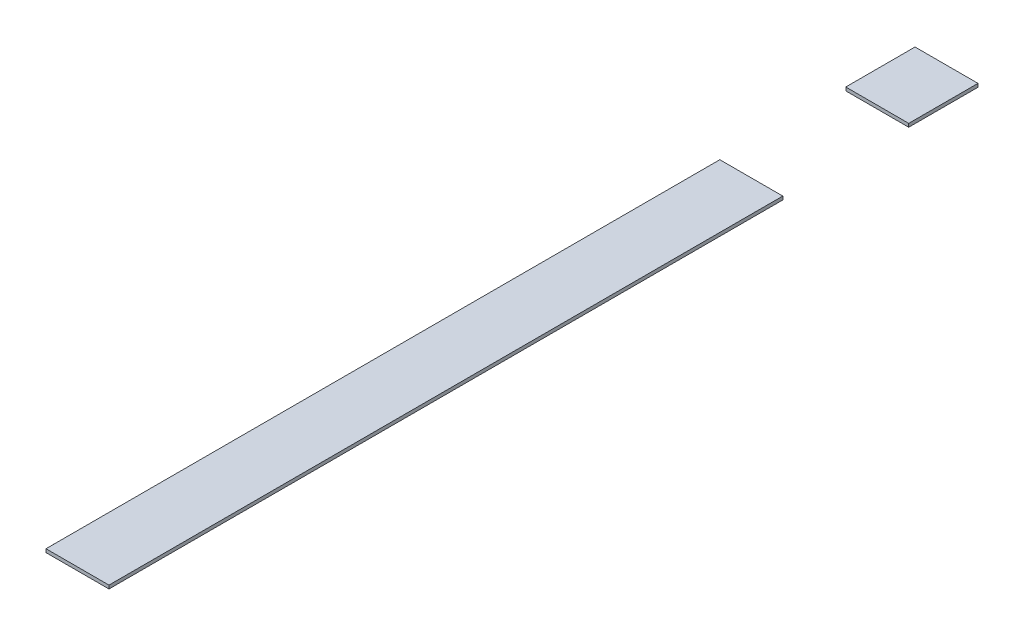
ISO-10303-21;
HEADER;
FILE_DESCRIPTION(('STEP AP214'),'2;1');
FILE_NAME('part.step','',(''),(''),'','','');
FILE_SCHEMA(('AUTOMOTIVE_DESIGN { 1 0 10303 214 1 1 1 1 }'));
ENDSEC;
DATA;
#1=APPLICATION_CONTEXT('core data for automotive mechanical design processes');
#2=APPLICATION_PROTOCOL_DEFINITION('international standard','automotive_design',2000,#1);
#3=PRODUCT_CONTEXT('',#1,'mechanical');
#4=PRODUCT('Part','Part','',(#3));
#5=PRODUCT_RELATED_PRODUCT_CATEGORY('part','',(#4));
#6=PRODUCT_DEFINITION_FORMATION('','',#4);
#7=PRODUCT_DEFINITION_CONTEXT('part definition',#1,'design');
#8=PRODUCT_DEFINITION('design','',#6,#7);
#9=PRODUCT_DEFINITION_SHAPE('','',#8);
#10=(LENGTH_UNIT() NAMED_UNIT(*) SI_UNIT(.MILLI.,.METRE.));
#11=(NAMED_UNIT(*) PLANE_ANGLE_UNIT() SI_UNIT($,.RADIAN.));
#12=(NAMED_UNIT(*) SI_UNIT($,.STERADIAN.) SOLID_ANGLE_UNIT());
#13=UNCERTAINTY_MEASURE_WITH_UNIT(LENGTH_MEASURE(1.E-05),#10,'distance_accuracy_value','');
#14=(GEOMETRIC_REPRESENTATION_CONTEXT(3) GLOBAL_UNCERTAINTY_ASSIGNED_CONTEXT((#13)) GLOBAL_UNIT_ASSIGNED_CONTEXT((#10,
#11,#12)) REPRESENTATION_CONTEXT('',''));
#15=CARTESIAN_POINT('',(0.,0.,0.));
#16=DIRECTION('',(0.,0.,1.));
#17=DIRECTION('',(1.,0.,0.));
#18=AXIS2_PLACEMENT_3D('',#15,#16,#17);
#19=CARTESIAN_POINT('',(-25.,20.1,-535.));
#20=DIRECTION('',(0.,1.,0.));
#21=DIRECTION('',(0.,0.,1.));
#22=AXIS2_PLACEMENT_3D('',#19,#20,#21);
#23=PLANE('',#22);
#24=DIRECTION('',(-1.,0.,0.));
#25=VECTOR('',#24,1.);
#26=CARTESIAN_POINT('',(-25.,20.1,-535.));
#27=LINE('',#26,#25);
#28=CARTESIAN_POINT('',(-25.,20.1,-535.));
#29=VERTEX_POINT('',#28);
#30=CARTESIAN_POINT('',(25.,20.1,-535.));
#31=VERTEX_POINT('',#30);
#32=EDGE_CURVE('P0_E20',#29,#31,#27,.F.);
#33=ORIENTED_EDGE('',*,*,#32,.F.);
#34=DIRECTION('',(0.,0.,-1.));
#35=VECTOR('',#34,1.);
#36=CARTESIAN_POINT('',(-25.,20.1,0.));
#37=LINE('',#36,#35);
#38=CARTESIAN_POINT('',(-25.,20.1,0.));
#39=VERTEX_POINT('',#38);
#40=EDGE_CURVE('P0_E80',#29,#39,#37,.F.);
#41=ORIENTED_EDGE('',*,*,#40,.T.);
#42=DIRECTION('',(1.,0.,0.));
#43=VECTOR('',#42,1.);
#44=CARTESIAN_POINT('',(-25.,20.1,0.));
#45=LINE('',#44,#43);
#46=CARTESIAN_POINT('',(25.,20.1,0.));
#47=VERTEX_POINT('',#46);
#48=EDGE_CURVE('P0_E68',#47,#39,#45,.F.);
#49=ORIENTED_EDGE('',*,*,#48,.F.);
#50=DIRECTION('',(0.,0.,-1.));
#51=VECTOR('',#50,1.);
#52=CARTESIAN_POINT('',(25.,20.1,0.));
#53=LINE('',#52,#51);
#54=EDGE_CURVE('P0_E56',#31,#47,#53,.F.);
#55=ORIENTED_EDGE('',*,*,#54,.F.);
#56=EDGE_LOOP('',(#33,#41,#49,#55));
#57=FACE_BOUND('',#56,.T.);
#58=ADVANCED_FACE('P0_F17',(#57),#23,.T.);
#59=CARTESIAN_POINT('',(-25.,17.4,-535.));
#60=DIRECTION('',(0.,0.,-1.));
#61=DIRECTION('',(-1.,0.,0.));
#62=AXIS2_PLACEMENT_3D('',#59,#60,#61);
#63=PLANE('',#62);
#64=DIRECTION('',(1.,0.,0.));
#65=VECTOR('',#64,1.);
#66=CARTESIAN_POINT('',(-25.,17.4,-535.));
#67=LINE('',#66,#65);
#68=CARTESIAN_POINT('',(-25.,17.4,-535.));
#69=VERTEX_POINT('',#68);
#70=CARTESIAN_POINT('',(25.,17.4,-535.));
#71=VERTEX_POINT('',#70);
#72=EDGE_CURVE('P0_E83',#69,#71,#67,.T.);
#73=ORIENTED_EDGE('',*,*,#72,.F.);
#74=DIRECTION('',(0.,1.,0.));
#75=VECTOR('',#74,1.);
#76=CARTESIAN_POINT('',(-25.,0.,-535.));
#77=LINE('',#76,#75);
#78=EDGE_CURVE('P0_E65',#69,#29,#77,.T.);
#79=ORIENTED_EDGE('',*,*,#78,.T.);
#80=ORIENTED_EDGE('',*,*,#32,.T.);
#81=DIRECTION('',(0.,1.,0.));
#82=VECTOR('',#81,1.);
#83=CARTESIAN_POINT('',(25.,0.,-535.));
#84=LINE('',#83,#82);
#85=EDGE_CURVE('P0_E62',#71,#31,#84,.T.);
#86=ORIENTED_EDGE('',*,*,#85,.F.);
#87=EDGE_LOOP('',(#73,#79,#80,#86));
#88=FACE_BOUND('',#87,.T.);
#89=ADVANCED_FACE('P0_F61',(#88),#63,.T.);
#90=CARTESIAN_POINT('',(25.,0.,0.));
#91=DIRECTION('',(1.,0.,0.));
#92=DIRECTION('',(0.,0.,-1.));
#93=AXIS2_PLACEMENT_3D('',#90,#91,#92);
#94=PLANE('',#93);
#95=DIRECTION('',(0.,1.,0.));
#96=VECTOR('',#95,1.);
#97=CARTESIAN_POINT('',(25.,20.1,0.));
#98=LINE('',#97,#96);
#99=CARTESIAN_POINT('',(25.,17.4,0.));
#100=VERTEX_POINT('',#99);
#101=EDGE_CURVE('P0_E70',#100,#47,#98,.T.);
#102=ORIENTED_EDGE('',*,*,#101,.F.);
#103=DIRECTION('',(0.,0.,-1.));
#104=VECTOR('',#103,1.);
#105=CARTESIAN_POINT('',(25.,17.4,0.));
#106=LINE('',#105,#104);
#107=EDGE_CURVE('P0_E74',#71,#100,#106,.F.);
#108=ORIENTED_EDGE('',*,*,#107,.F.);
#109=ORIENTED_EDGE('',*,*,#85,.T.);
#110=ORIENTED_EDGE('',*,*,#54,.T.);
#111=EDGE_LOOP('',(#102,#108,#109,#110));
#112=FACE_BOUND('',#111,.T.);
#113=ADVANCED_FACE('P0_F72',(#112),#94,.T.);
#114=CARTESIAN_POINT('',(-25.,20.1,0.));
#115=DIRECTION('',(0.,0.,1.));
#116=DIRECTION('',(1.,0.,0.));
#117=AXIS2_PLACEMENT_3D('',#114,#115,#116);
#118=PLANE('',#117);
#119=ORIENTED_EDGE('',*,*,#48,.T.);
#120=DIRECTION('',(0.,1.,0.));
#121=VECTOR('',#120,1.);
#122=CARTESIAN_POINT('',(-25.,0.,0.));
#123=LINE('',#122,#121);
#124=CARTESIAN_POINT('',(-25.,17.4,0.));
#125=VERTEX_POINT('',#124);
#126=EDGE_CURVE('P0_E35',#39,#125,#123,.F.);
#127=ORIENTED_EDGE('',*,*,#126,.T.);
#128=DIRECTION('',(1.,0.,0.));
#129=VECTOR('',#128,1.);
#130=CARTESIAN_POINT('',(-25.,17.4,0.));
#131=LINE('',#130,#129);
#132=EDGE_CURVE('P0_E26',#100,#125,#131,.F.);
#133=ORIENTED_EDGE('',*,*,#132,.F.);
#134=ORIENTED_EDGE('',*,*,#101,.T.);
#135=EDGE_LOOP('',(#119,#127,#133,#134));
#136=FACE_BOUND('',#135,.T.);
#137=ADVANCED_FACE('P0_F89',(#136),#118,.T.);
#138=CARTESIAN_POINT('',(-25.,0.,0.));
#139=DIRECTION('',(1.,0.,0.));
#140=DIRECTION('',(0.,0.,-1.));
#141=AXIS2_PLACEMENT_3D('',#138,#139,#140);
#142=PLANE('',#141);
#143=ORIENTED_EDGE('',*,*,#40,.F.);
#144=ORIENTED_EDGE('',*,*,#78,.F.);
#145=DIRECTION('',(0.,0.,-1.));
#146=VECTOR('',#145,1.);
#147=CARTESIAN_POINT('',(-25.,17.4,0.));
#148=LINE('',#147,#146);
#149=EDGE_CURVE('P0_E11',#125,#69,#148,.T.);
#150=ORIENTED_EDGE('',*,*,#149,.F.);
#151=ORIENTED_EDGE('',*,*,#126,.F.);
#152=EDGE_LOOP('',(#143,#144,#150,#151));
#153=FACE_BOUND('',#152,.T.);
#154=ADVANCED_FACE('P0_F91',(#153),#142,.F.);
#155=CARTESIAN_POINT('',(-25.,17.4,0.));
#156=DIRECTION('',(0.,-1.,0.));
#157=DIRECTION('',(0.,0.,-1.));
#158=AXIS2_PLACEMENT_3D('',#155,#156,#157);
#159=PLANE('',#158);
#160=ORIENTED_EDGE('',*,*,#132,.T.);
#161=ORIENTED_EDGE('',*,*,#149,.T.);
#162=ORIENTED_EDGE('',*,*,#72,.T.);
#163=ORIENTED_EDGE('',*,*,#107,.T.);
#164=EDGE_LOOP('',(#160,#161,#162,#163));
#165=FACE_BOUND('',#164,.T.);
#166=ADVANCED_FACE('P0_F88',(#165),#159,.T.);
#167=CLOSED_SHELL('',(#58,#89,#113,#137,#154,#166));
#168=MANIFOLD_SOLID_BREP('P0_B1',#167);
#169=CARTESIAN_POINT('',(-25.,17.4,-635.));
#170=DIRECTION('',(0.,-1.,0.));
#171=DIRECTION('',(0.,0.,-1.));
#172=AXIS2_PLACEMENT_3D('',#169,#170,#171);
#173=PLANE('',#172);
#174=DIRECTION('',(1.,0.,0.));
#175=VECTOR('',#174,1.);
#176=CARTESIAN_POINT('',(-25.,17.4,-635.));
#177=LINE('',#176,#175);
#178=CARTESIAN_POINT('',(-25.,17.4,-635.));
#179=VERTEX_POINT('',#178);
#180=CARTESIAN_POINT('',(25.,17.4,-635.));
#181=VERTEX_POINT('',#180);
#182=EDGE_CURVE('P1_E20',#179,#181,#177,.T.);
#183=ORIENTED_EDGE('',*,*,#182,.F.);
#184=DIRECTION('',(0.,0.,-1.));
#185=VECTOR('',#184,1.);
#186=CARTESIAN_POINT('',(-25.,17.4,0.));
#187=LINE('',#186,#185);
#188=CARTESIAN_POINT('',(-25.,17.4,-690.));
#189=VERTEX_POINT('',#188);
#190=EDGE_CURVE('P1_E80',#179,#189,#187,.T.);
#191=ORIENTED_EDGE('',*,*,#190,.T.);
#192=DIRECTION('',(-1.,0.,0.));
#193=VECTOR('',#192,1.);
#194=CARTESIAN_POINT('',(-25.,17.4,-690.));
#195=LINE('',#194,#193);
#196=CARTESIAN_POINT('',(25.,17.4,-690.));
#197=VERTEX_POINT('',#196);
#198=EDGE_CURVE('P1_E61',#197,#189,#195,.T.);
#199=ORIENTED_EDGE('',*,*,#198,.F.);
#200=DIRECTION('',(0.,0.,-1.));
#201=VECTOR('',#200,1.);
#202=CARTESIAN_POINT('',(25.,17.4,0.));
#203=LINE('',#202,#201);
#204=EDGE_CURVE('P1_E56',#181,#197,#203,.T.);
#205=ORIENTED_EDGE('',*,*,#204,.F.);
#206=EDGE_LOOP('',(#183,#191,#199,#205));
#207=FACE_BOUND('',#206,.T.);
#208=ADVANCED_FACE('P1_F17',(#207),#173,.T.);
#209=CARTESIAN_POINT('',(-25.,20.1,-635.));
#210=DIRECTION('',(0.,0.,1.));
#211=DIRECTION('',(1.,0.,0.));
#212=AXIS2_PLACEMENT_3D('',#209,#210,#211);
#213=PLANE('',#212);
#214=DIRECTION('',(1.,0.,0.));
#215=VECTOR('',#214,1.);
#216=CARTESIAN_POINT('',(-25.,20.1,-635.));
#217=LINE('',#216,#215);
#218=CARTESIAN_POINT('',(-25.,20.1,-635.));
#219=VERTEX_POINT('',#218);
#220=CARTESIAN_POINT('',(25.,20.1,-635.));
#221=VERTEX_POINT('',#220);
#222=EDGE_CURVE('P1_E83',#219,#221,#217,.T.);
#223=ORIENTED_EDGE('',*,*,#222,.F.);
#224=DIRECTION('',(0.,1.,0.));
#225=VECTOR('',#224,1.);
#226=CARTESIAN_POINT('',(-25.,0.,-635.));
#227=LINE('',#226,#225);
#228=EDGE_CURVE('P1_E68',#219,#179,#227,.F.);
#229=ORIENTED_EDGE('',*,*,#228,.T.);
#230=ORIENTED_EDGE('',*,*,#182,.T.);
#231=DIRECTION('',(0.,1.,0.));
#232=VECTOR('',#231,1.);
#233=CARTESIAN_POINT('',(25.,0.,-635.));
#234=LINE('',#233,#232);
#235=EDGE_CURVE('P1_E63',#221,#181,#234,.F.);
#236=ORIENTED_EDGE('',*,*,#235,.F.);
#237=EDGE_LOOP('',(#223,#229,#230,#236));
#238=FACE_BOUND('',#237,.T.);
#239=ADVANCED_FACE('P1_F65',(#238),#213,.T.);
#240=CARTESIAN_POINT('',(25.,0.,0.));
#241=DIRECTION('',(1.,0.,0.));
#242=DIRECTION('',(0.,0.,-1.));
#243=AXIS2_PLACEMENT_3D('',#240,#241,#242);
#244=PLANE('',#243);
#245=DIRECTION('',(0.,0.,1.));
#246=VECTOR('',#245,1.);
#247=CARTESIAN_POINT('',(25.,20.1,-690.));
#248=LINE('',#247,#246);
#249=CARTESIAN_POINT('',(25.,20.1,-690.));
#250=VERTEX_POINT('',#249);
#251=EDGE_CURVE('P1_E72',#221,#250,#248,.F.);
#252=ORIENTED_EDGE('',*,*,#251,.F.);
#253=ORIENTED_EDGE('',*,*,#235,.T.);
#254=ORIENTED_EDGE('',*,*,#204,.T.);
#255=DIRECTION('',(0.,1.,0.));
#256=VECTOR('',#255,1.);
#257=CARTESIAN_POINT('',(25.,17.4,-690.));
#258=LINE('',#257,#256);
#259=EDGE_CURVE('P1_E74',#250,#197,#258,.F.);
#260=ORIENTED_EDGE('',*,*,#259,.F.);
#261=EDGE_LOOP('',(#252,#253,#254,#260));
#262=FACE_BOUND('',#261,.T.);
#263=ADVANCED_FACE('P1_F70',(#262),#244,.T.);
#264=CARTESIAN_POINT('',(-25.,17.4,-690.));
#265=DIRECTION('',(0.,0.,-1.));
#266=DIRECTION('',(-1.,0.,0.));
#267=AXIS2_PLACEMENT_3D('',#264,#265,#266);
#268=PLANE('',#267);
#269=ORIENTED_EDGE('',*,*,#198,.T.);
#270=DIRECTION('',(0.,1.,0.));
#271=VECTOR('',#270,1.);
#272=CARTESIAN_POINT('',(-25.,0.,-690.));
#273=LINE('',#272,#271);
#274=CARTESIAN_POINT('',(-25.,20.1,-690.));
#275=VERTEX_POINT('',#274);
#276=EDGE_CURVE('P1_E35',#189,#275,#273,.T.);
#277=ORIENTED_EDGE('',*,*,#276,.T.);
#278=DIRECTION('',(1.,0.,0.));
#279=VECTOR('',#278,1.);
#280=CARTESIAN_POINT('',(-25.,20.1,-690.));
#281=LINE('',#280,#279);
#282=EDGE_CURVE('P1_E26',#250,#275,#281,.F.);
#283=ORIENTED_EDGE('',*,*,#282,.F.);
#284=ORIENTED_EDGE('',*,*,#259,.T.);
#285=EDGE_LOOP('',(#269,#277,#283,#284));
#286=FACE_BOUND('',#285,.T.);
#287=ADVANCED_FACE('P1_F89',(#286),#268,.T.);
#288=CARTESIAN_POINT('',(-25.,0.,0.));
#289=DIRECTION('',(1.,0.,0.));
#290=DIRECTION('',(0.,0.,-1.));
#291=AXIS2_PLACEMENT_3D('',#288,#289,#290);
#292=PLANE('',#291);
#293=ORIENTED_EDGE('',*,*,#276,.F.);
#294=ORIENTED_EDGE('',*,*,#190,.F.);
#295=ORIENTED_EDGE('',*,*,#228,.F.);
#296=DIRECTION('',(0.,0.,1.));
#297=VECTOR('',#296,1.);
#298=CARTESIAN_POINT('',(-25.,20.1,-690.));
#299=LINE('',#298,#297);
#300=EDGE_CURVE('P1_E11',#275,#219,#299,.T.);
#301=ORIENTED_EDGE('',*,*,#300,.F.);
#302=EDGE_LOOP('',(#293,#294,#295,#301));
#303=FACE_BOUND('',#302,.T.);
#304=ADVANCED_FACE('P1_F91',(#303),#292,.F.);
#305=CARTESIAN_POINT('',(-25.,20.1,-690.));
#306=DIRECTION('',(0.,1.,0.));
#307=DIRECTION('',(0.,0.,1.));
#308=AXIS2_PLACEMENT_3D('',#305,#306,#307);
#309=PLANE('',#308);
#310=ORIENTED_EDGE('',*,*,#282,.T.);
#311=ORIENTED_EDGE('',*,*,#300,.T.);
#312=ORIENTED_EDGE('',*,*,#222,.T.);
#313=ORIENTED_EDGE('',*,*,#251,.T.);
#314=EDGE_LOOP('',(#310,#311,#312,#313));
#315=FACE_BOUND('',#314,.T.);
#316=ADVANCED_FACE('P1_F88',(#315),#309,.T.);
#317=CLOSED_SHELL('',(#208,#239,#263,#287,#304,#316));
#318=MANIFOLD_SOLID_BREP('P1_B1',#317);
#319=ADVANCED_BREP_SHAPE_REPRESENTATION('',(#18,#168,#318),#14);
#320=SHAPE_DEFINITION_REPRESENTATION(#9,#319);
ENDSEC;
END-ISO-10303-21;
